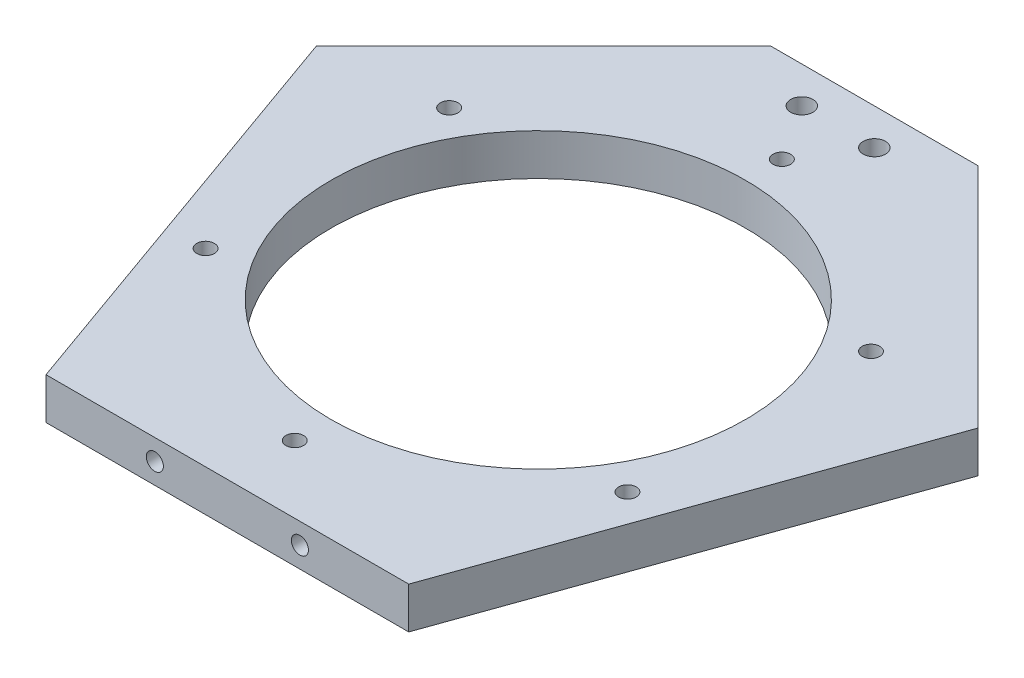
ISO-10303-21;
HEADER;
FILE_DESCRIPTION(('STEP AP214'),'2;1');
FILE_NAME('part.step','',(''),(''),'','','');
FILE_SCHEMA(('AUTOMOTIVE_DESIGN { 1 0 10303 214 1 1 1 1 }'));
ENDSEC;
DATA;
#1=APPLICATION_CONTEXT('core data for automotive mechanical design processes');
#2=APPLICATION_PROTOCOL_DEFINITION('international standard','automotive_design',2000,#1);
#3=PRODUCT_CONTEXT('',#1,'mechanical');
#4=PRODUCT('Part','Part','',(#3));
#5=PRODUCT_RELATED_PRODUCT_CATEGORY('part','',(#4));
#6=PRODUCT_DEFINITION_FORMATION('','',#4);
#7=PRODUCT_DEFINITION_CONTEXT('part definition',#1,'design');
#8=PRODUCT_DEFINITION('design','',#6,#7);
#9=PRODUCT_DEFINITION_SHAPE('','',#8);
#10=(LENGTH_UNIT() NAMED_UNIT(*) SI_UNIT(.MILLI.,.METRE.));
#11=(NAMED_UNIT(*) PLANE_ANGLE_UNIT() SI_UNIT($,.RADIAN.));
#12=(NAMED_UNIT(*) SI_UNIT($,.STERADIAN.) SOLID_ANGLE_UNIT());
#13=UNCERTAINTY_MEASURE_WITH_UNIT(LENGTH_MEASURE(1.E-05),#10,'distance_accuracy_value','');
#14=(GEOMETRIC_REPRESENTATION_CONTEXT(3) GLOBAL_UNCERTAINTY_ASSIGNED_CONTEXT((#13)) GLOBAL_UNIT_ASSIGNED_CONTEXT((#10,
#11,#12)) REPRESENTATION_CONTEXT('',''));
#15=CARTESIAN_POINT('',(0.,0.,0.));
#16=DIRECTION('',(0.,0.,1.));
#17=DIRECTION('',(1.,0.,0.));
#18=AXIS2_PLACEMENT_3D('',#15,#16,#17);
#19=CARTESIAN_POINT('',(0.,4.,0.));
#20=DIRECTION('',(0.,1.,0.));
#21=DIRECTION('',(0.,0.,1.));
#22=AXIS2_PLACEMENT_3D('',#19,#20,#21);
#23=PLANE('',#22);
#24=CARTESIAN_POINT('',(-7.,4.,-57.8528137423857));
#25=DIRECTION('',(0.,1.,0.));
#26=DIRECTION('',(0.,0.,1.));
#27=AXIS2_PLACEMENT_3D('',#24,#25,#26);
#28=CIRCLE('',#27,2.15);
#29=CARTESIAN_POINT('',(-7.,4.,-55.7028137423857));
#30=VERTEX_POINT('',#29);
#31=EDGE_CURVE('E269',#30,#30,#28,.T.);
#32=ORIENTED_EDGE('',*,*,#31,.F.);
#33=EDGE_LOOP('',(#32));
#34=FACE_BOUND('',#33,.T.);
#35=CARTESIAN_POINT('',(7.,4.,-57.8528137423857));
#36=DIRECTION('',(0.,1.,0.));
#37=DIRECTION('',(0.,0.,1.));
#38=AXIS2_PLACEMENT_3D('',#35,#36,#37);
#39=CIRCLE('',#38,2.15);
#40=CARTESIAN_POINT('',(7.,4.,-55.7028137423857));
#41=VERTEX_POINT('',#40);
#42=EDGE_CURVE('E271',#41,#41,#39,.T.);
#43=ORIENTED_EDGE('',*,*,#42,.F.);
#44=EDGE_LOOP('',(#43));
#45=FACE_BOUND('',#44,.T.);
#46=CARTESIAN_POINT('',(0.,4.,-47.));
#47=DIRECTION('',(0.,1.,0.));
#48=DIRECTION('',(0.,0.,1.));
#49=AXIS2_PLACEMENT_3D('',#46,#47,#48);
#50=CIRCLE('',#49,1.69999999999999);
#51=CARTESIAN_POINT('',(0.,4.,-45.3));
#52=VERTEX_POINT('',#51);
#53=EDGE_CURVE('E316',#52,#52,#50,.T.);
#54=ORIENTED_EDGE('',*,*,#53,.F.);
#55=EDGE_LOOP('',(#54));
#56=FACE_BOUND('',#55,.T.);
#57=CARTESIAN_POINT('',(40.7031939778709,4.,-23.5000000000041));
#58=DIRECTION('',(0.,1.,0.));
#59=DIRECTION('',(0.,0.,1.));
#60=AXIS2_PLACEMENT_3D('',#57,#58,#59);
#61=CIRCLE('',#60,1.69999999999999);
#62=CARTESIAN_POINT('',(40.7031939778709,4.,-21.8000000000041));
#63=VERTEX_POINT('',#62);
#64=EDGE_CURVE('E322',#63,#63,#61,.T.);
#65=ORIENTED_EDGE('',*,*,#64,.F.);
#66=EDGE_LOOP('',(#65));
#67=FACE_BOUND('',#66,.T.);
#68=CARTESIAN_POINT('',(40.7031939778756,4.,23.4999999999959));
#69=DIRECTION('',(0.,1.,0.));
#70=DIRECTION('',(0.,0.,1.));
#71=AXIS2_PLACEMENT_3D('',#68,#69,#70);
#72=CIRCLE('',#71,1.69999999999999);
#73=CARTESIAN_POINT('',(40.7031939778756,4.,25.1999999999959));
#74=VERTEX_POINT('',#73);
#75=EDGE_CURVE('E330',#74,#74,#72,.T.);
#76=ORIENTED_EDGE('',*,*,#75,.F.);
#77=EDGE_LOOP('',(#76));
#78=FACE_BOUND('',#77,.T.);
#79=CARTESIAN_POINT('',(9.33923072269093E-12,4.,47.));
#80=DIRECTION('',(0.,1.,0.));
#81=DIRECTION('',(0.,0.,1.));
#82=AXIS2_PLACEMENT_3D('',#79,#80,#81);
#83=CIRCLE('',#82,1.69999999999999);
#84=CARTESIAN_POINT('',(9.33923072269093E-12,4.,48.7));
#85=VERTEX_POINT('',#84);
#86=EDGE_CURVE('E336',#85,#85,#83,.T.);
#87=ORIENTED_EDGE('',*,*,#86,.F.);
#88=EDGE_LOOP('',(#87));
#89=FACE_BOUND('',#88,.T.);
#90=CARTESIAN_POINT('',(-40.7031939778616,4.,23.5000000000041));
#91=DIRECTION('',(0.,1.,0.));
#92=DIRECTION('',(0.,0.,1.));
#93=AXIS2_PLACEMENT_3D('',#90,#91,#92);
#94=CIRCLE('',#93,1.69999999999999);
#95=CARTESIAN_POINT('',(-40.7031939778616,4.,25.200000000004));
#96=VERTEX_POINT('',#95);
#97=EDGE_CURVE('E342',#96,#96,#94,.T.);
#98=ORIENTED_EDGE('',*,*,#97,.F.);
#99=EDGE_LOOP('',(#98));
#100=FACE_BOUND('',#99,.T.);
#101=CARTESIAN_POINT('',(-40.7031939778663,4.,-23.499999999996));
#102=DIRECTION('',(0.,1.,0.));
#103=DIRECTION('',(0.,0.,1.));
#104=AXIS2_PLACEMENT_3D('',#101,#102,#103);
#105=CIRCLE('',#104,1.69999999999999);
#106=CARTESIAN_POINT('',(-40.7031939778663,4.,-21.799999999996));
#107=VERTEX_POINT('',#106);
#108=EDGE_CURVE('E348',#107,#107,#105,.T.);
#109=ORIENTED_EDGE('',*,*,#108,.F.);
#110=EDGE_LOOP('',(#109));
#111=FACE_BOUND('',#110,.T.);
#112=DIRECTION('',(-0.707106781186547,0.,-0.707106781186548));
#113=VECTOR('',#112,1.);
#114=CARTESIAN_POINT('',(63.8406204335659,4.,-21.0121933088198));
#115=LINE('',#114,#113);
#116=CARTESIAN_POINT('',(63.8406204335659,4.,-21.0121933088198));
#117=VERTEX_POINT('',#116);
#118=CARTESIAN_POINT('',(20.,4.,-64.8528137423857));
#119=VERTEX_POINT('',#118);
#120=EDGE_CURVE('E146',#117,#119,#115,.T.);
#121=ORIENTED_EDGE('',*,*,#120,.T.);
#122=DIRECTION('',(-1.,0.,0.));
#123=VECTOR('',#122,1.);
#124=CARTESIAN_POINT('',(20.,4.,-64.8528137423857));
#125=LINE('',#124,#123);
#126=CARTESIAN_POINT('',(-20.,4.,-64.8528137423857));
#127=VERTEX_POINT('',#126);
#128=EDGE_CURVE('E100',#119,#127,#125,.T.);
#129=ORIENTED_EDGE('',*,*,#128,.T.);
#130=DIRECTION('',(-0.707106781186547,0.,0.707106781186548));
#131=VECTOR('',#130,1.);
#132=CARTESIAN_POINT('',(-20.,4.,-64.8528137423857));
#133=LINE('',#132,#131);
#134=CARTESIAN_POINT('',(-63.8406204335659,4.,-21.0121933088198));
#135=VERTEX_POINT('',#134);
#136=EDGE_CURVE('E115',#127,#135,#133,.T.);
#137=ORIENTED_EDGE('',*,*,#136,.T.);
#138=DIRECTION('',(0.335384239078004,0.,0.942081425450087));
#139=VECTOR('',#138,1.);
#140=CARTESIAN_POINT('',(-63.8406204335659,4.,-21.0121933088198));
#141=LINE('',#140,#139);
#142=CARTESIAN_POINT('',(-35.,4.,60.));
#143=VERTEX_POINT('',#142);
#144=EDGE_CURVE('E109',#135,#143,#141,.T.);
#145=ORIENTED_EDGE('',*,*,#144,.T.);
#146=DIRECTION('',(1.,0.,0.));
#147=VECTOR('',#146,1.);
#148=CARTESIAN_POINT('',(-35.,4.,60.));
#149=LINE('',#148,#147);
#150=CARTESIAN_POINT('',(35.,4.,60.));
#151=VERTEX_POINT('',#150);
#152=EDGE_CURVE('E113',#143,#151,#149,.T.);
#153=ORIENTED_EDGE('',*,*,#152,.T.);
#154=DIRECTION('',(0.335384239078004,0.,-0.942081425450087));
#155=VECTOR('',#154,1.);
#156=CARTESIAN_POINT('',(35.,4.,60.));
#157=LINE('',#156,#155);
#158=EDGE_CURVE('E62',#151,#117,#157,.T.);
#159=ORIENTED_EDGE('',*,*,#158,.T.);
#160=EDGE_LOOP('',(#121,#129,#137,#145,#153,#159));
#161=FACE_BOUND('',#160,.T.);
#162=CARTESIAN_POINT('',(0.,4.,0.));
#163=DIRECTION('',(0.,1.,0.));
#164=DIRECTION('',(0.,0.,1.));
#165=AXIS2_PLACEMENT_3D('',#162,#163,#164);
#166=CIRCLE('',#165,40.);
#167=CARTESIAN_POINT('',(0.,4.,40.));
#168=VERTEX_POINT('',#167);
#169=EDGE_CURVE('E138',#168,#168,#166,.T.);
#170=ORIENTED_EDGE('',*,*,#169,.F.);
#171=EDGE_LOOP('',(#170));
#172=FACE_BOUND('',#171,.T.);
#173=ADVANCED_FACE('F45',(#34,#45,#56,#67,#78,#89,#100,#111,#161,#172),#23,.T.);
#174=CARTESIAN_POINT('',(0.,-4.,0.));
#175=DIRECTION('',(0.,1.,0.));
#176=DIRECTION('',(0.,0.,1.));
#177=AXIS2_PLACEMENT_3D('',#174,#175,#176);
#178=PLANE('',#177);
#179=CARTESIAN_POINT('',(-7.,-4.,-57.8528137423857));
#180=DIRECTION('',(0.,1.,0.));
#181=DIRECTION('',(0.,0.,1.));
#182=AXIS2_PLACEMENT_3D('',#179,#180,#181);
#183=CIRCLE('',#182,2.15);
#184=CARTESIAN_POINT('',(-7.,-4.,-55.7028137423857));
#185=VERTEX_POINT('',#184);
#186=EDGE_CURVE('E267',#185,#185,#183,.T.);
#187=ORIENTED_EDGE('',*,*,#186,.T.);
#188=EDGE_LOOP('',(#187));
#189=FACE_BOUND('',#188,.T.);
#190=CARTESIAN_POINT('',(7.,-4.,-57.8528137423857));
#191=DIRECTION('',(0.,1.,0.));
#192=DIRECTION('',(0.,0.,1.));
#193=AXIS2_PLACEMENT_3D('',#190,#191,#192);
#194=CIRCLE('',#193,2.15);
#195=CARTESIAN_POINT('',(7.,-4.,-55.7028137423857));
#196=VERTEX_POINT('',#195);
#197=EDGE_CURVE('E276',#196,#196,#194,.T.);
#198=ORIENTED_EDGE('',*,*,#197,.T.);
#199=EDGE_LOOP('',(#198));
#200=FACE_BOUND('',#199,.T.);
#201=CARTESIAN_POINT('',(0.,-4.,-47.));
#202=DIRECTION('',(0.,1.,0.));
#203=DIRECTION('',(0.,0.,1.));
#204=AXIS2_PLACEMENT_3D('',#201,#202,#203);
#205=CIRCLE('',#204,1.7);
#206=CARTESIAN_POINT('',(0.,-4.,-45.3));
#207=VERTEX_POINT('',#206);
#208=EDGE_CURVE('E319',#207,#207,#205,.T.);
#209=ORIENTED_EDGE('',*,*,#208,.T.);
#210=EDGE_LOOP('',(#209));
#211=FACE_BOUND('',#210,.T.);
#212=CARTESIAN_POINT('',(40.7031939778709,-4.,-23.5000000000041));
#213=DIRECTION('',(0.,1.,0.));
#214=DIRECTION('',(0.,0.,1.));
#215=AXIS2_PLACEMENT_3D('',#212,#213,#214);
#216=CIRCLE('',#215,1.7);
#217=CARTESIAN_POINT('',(40.7031939778709,-4.,-21.800000000004));
#218=VERTEX_POINT('',#217);
#219=EDGE_CURVE('E326',#218,#218,#216,.T.);
#220=ORIENTED_EDGE('',*,*,#219,.T.);
#221=EDGE_LOOP('',(#220));
#222=FACE_BOUND('',#221,.T.);
#223=CARTESIAN_POINT('',(40.7031939778756,-4.,23.4999999999959));
#224=DIRECTION('',(0.,1.,0.));
#225=DIRECTION('',(0.,0.,1.));
#226=AXIS2_PLACEMENT_3D('',#223,#224,#225);
#227=CIRCLE('',#226,1.7);
#228=CARTESIAN_POINT('',(40.7031939778756,-4.,25.199999999996));
#229=VERTEX_POINT('',#228);
#230=EDGE_CURVE('E333',#229,#229,#227,.T.);
#231=ORIENTED_EDGE('',*,*,#230,.T.);
#232=EDGE_LOOP('',(#231));
#233=FACE_BOUND('',#232,.T.);
#234=CARTESIAN_POINT('',(9.33923072269093E-12,-4.,47.));
#235=DIRECTION('',(0.,1.,0.));
#236=DIRECTION('',(0.,0.,1.));
#237=AXIS2_PLACEMENT_3D('',#234,#235,#236);
#238=CIRCLE('',#237,1.7);
#239=CARTESIAN_POINT('',(9.33923072269093E-12,-4.,48.7));
#240=VERTEX_POINT('',#239);
#241=EDGE_CURVE('E339',#240,#240,#238,.T.);
#242=ORIENTED_EDGE('',*,*,#241,.T.);
#243=EDGE_LOOP('',(#242));
#244=FACE_BOUND('',#243,.T.);
#245=CARTESIAN_POINT('',(-40.7031939778616,-4.,23.5000000000041));
#246=DIRECTION('',(0.,1.,0.));
#247=DIRECTION('',(0.,0.,1.));
#248=AXIS2_PLACEMENT_3D('',#245,#246,#247);
#249=CIRCLE('',#248,1.7);
#250=CARTESIAN_POINT('',(-40.7031939778616,-4.,25.2000000000041));
#251=VERTEX_POINT('',#250);
#252=EDGE_CURVE('E345',#251,#251,#249,.T.);
#253=ORIENTED_EDGE('',*,*,#252,.T.);
#254=EDGE_LOOP('',(#253));
#255=FACE_BOUND('',#254,.T.);
#256=CARTESIAN_POINT('',(-40.7031939778663,-4.,-23.499999999996));
#257=DIRECTION('',(0.,1.,0.));
#258=DIRECTION('',(0.,0.,1.));
#259=AXIS2_PLACEMENT_3D('',#256,#257,#258);
#260=CIRCLE('',#259,1.7);
#261=CARTESIAN_POINT('',(-40.7031939778663,-4.,-21.799999999996));
#262=VERTEX_POINT('',#261);
#263=EDGE_CURVE('E351',#262,#262,#260,.T.);
#264=ORIENTED_EDGE('',*,*,#263,.T.);
#265=EDGE_LOOP('',(#264));
#266=FACE_BOUND('',#265,.T.);
#267=DIRECTION('',(-0.707106781186547,0.,-0.707106781186548));
#268=VECTOR('',#267,1.);
#269=CARTESIAN_POINT('',(63.8406204335659,-4.,-21.0121933088198));
#270=LINE('',#269,#268);
#271=CARTESIAN_POINT('',(63.8406204335659,-4.,-21.0121933088198));
#272=VERTEX_POINT('',#271);
#273=CARTESIAN_POINT('',(20.,-4.,-64.8528137423857));
#274=VERTEX_POINT('',#273);
#275=EDGE_CURVE('E134',#272,#274,#270,.T.);
#276=ORIENTED_EDGE('',*,*,#275,.F.);
#277=DIRECTION('',(0.335384239078004,0.,-0.942081425450087));
#278=VECTOR('',#277,1.);
#279=CARTESIAN_POINT('',(35.,-4.,60.));
#280=LINE('',#279,#278);
#281=CARTESIAN_POINT('',(35.,-4.,60.));
#282=VERTEX_POINT('',#281);
#283=EDGE_CURVE('E92',#282,#272,#280,.T.);
#284=ORIENTED_EDGE('',*,*,#283,.F.);
#285=DIRECTION('',(1.,0.,0.));
#286=VECTOR('',#285,1.);
#287=CARTESIAN_POINT('',(-35.,-4.,60.));
#288=LINE('',#287,#286);
#289=CARTESIAN_POINT('',(-35.,-4.,60.));
#290=VERTEX_POINT('',#289);
#291=EDGE_CURVE('E86',#290,#282,#288,.T.);
#292=ORIENTED_EDGE('',*,*,#291,.F.);
#293=DIRECTION('',(0.335384239078004,0.,0.942081425450087));
#294=VECTOR('',#293,1.);
#295=CARTESIAN_POINT('',(-63.8406204335659,-4.,-21.0121933088198));
#296=LINE('',#295,#294);
#297=CARTESIAN_POINT('',(-63.8406204335659,-4.,-21.0121933088198));
#298=VERTEX_POINT('',#297);
#299=EDGE_CURVE('E123',#298,#290,#296,.T.);
#300=ORIENTED_EDGE('',*,*,#299,.F.);
#301=DIRECTION('',(-0.707106781186547,0.,0.707106781186548));
#302=VECTOR('',#301,1.);
#303=CARTESIAN_POINT('',(-20.,-4.,-64.8528137423857));
#304=LINE('',#303,#302);
#305=CARTESIAN_POINT('',(-20.,-4.,-64.8528137423857));
#306=VERTEX_POINT('',#305);
#307=EDGE_CURVE('E140',#306,#298,#304,.T.);
#308=ORIENTED_EDGE('',*,*,#307,.F.);
#309=DIRECTION('',(-1.,0.,0.));
#310=VECTOR('',#309,1.);
#311=CARTESIAN_POINT('',(20.,-4.,-64.8528137423857));
#312=LINE('',#311,#310);
#313=EDGE_CURVE('E137',#274,#306,#312,.T.);
#314=ORIENTED_EDGE('',*,*,#313,.F.);
#315=EDGE_LOOP('',(#276,#284,#292,#300,#308,#314));
#316=FACE_BOUND('',#315,.T.);
#317=CARTESIAN_POINT('',(0.,-4.,0.));
#318=DIRECTION('',(0.,1.,0.));
#319=DIRECTION('',(0.,0.,1.));
#320=AXIS2_PLACEMENT_3D('',#317,#318,#319);
#321=CIRCLE('',#320,40.);
#322=CARTESIAN_POINT('',(0.,-4.,40.));
#323=VERTEX_POINT('',#322);
#324=EDGE_CURVE('E354',#323,#323,#321,.T.);
#325=ORIENTED_EDGE('',*,*,#324,.T.);
#326=EDGE_LOOP('',(#325));
#327=FACE_BOUND('',#326,.T.);
#328=ADVANCED_FACE('F155',(#189,#200,#211,#222,#233,#244,#255,#266,#316,#327),#178,.F.);
#329=CARTESIAN_POINT('',(63.8406204335659,4.,-21.0121933088198));
#330=DIRECTION('',(-0.707106781186548,0.,0.707106781186547));
#331=DIRECTION('',(0.707106781186547,0.,0.707106781186548));
#332=AXIS2_PLACEMENT_3D('',#329,#330,#331);
#333=PLANE('',#332);
#334=CARTESIAN_POINT('',(32.5269119345812,0.,-52.3259018078045));
#335=DIRECTION('',(0.707106781186548,0.,-0.707106781186548));
#336=DIRECTION('',(-0.707106781186548,0.,-0.707106781186548));
#337=AXIS2_PLACEMENT_3D('',#334,#335,#336);
#338=CIRCLE('',#337,1.64999999999999);
#339=CARTESIAN_POINT('',(31.3601857456234,0.,-53.4926279967623));
#340=VERTEX_POINT('',#339);
#341=EDGE_CURVE('E303',#340,#340,#338,.T.);
#342=ORIENTED_EDGE('',*,*,#341,.F.);
#343=EDGE_LOOP('',(#342));
#344=FACE_BOUND('',#343,.T.);
#345=CARTESIAN_POINT('',(52.3259018078045,0.,-32.5269119345812));
#346=DIRECTION('',(0.707106781186548,0.,-0.707106781186548));
#347=DIRECTION('',(-0.707106781186548,0.,-0.707106781186548));
#348=AXIS2_PLACEMENT_3D('',#345,#346,#347);
#349=CIRCLE('',#348,1.64999999999999);
#350=CARTESIAN_POINT('',(51.1591756188467,0.,-33.693638123539));
#351=VERTEX_POINT('',#350);
#352=EDGE_CURVE('E309',#351,#351,#349,.T.);
#353=ORIENTED_EDGE('',*,*,#352,.F.);
#354=EDGE_LOOP('',(#353));
#355=FACE_BOUND('',#354,.T.);
#356=ORIENTED_EDGE('',*,*,#275,.T.);
#357=DIRECTION('',(0.,-1.,0.));
#358=VECTOR('',#357,1.);
#359=CARTESIAN_POINT('',(20.,4.,-64.8528137423857));
#360=LINE('',#359,#358);
#361=EDGE_CURVE('E11',#119,#274,#360,.T.);
#362=ORIENTED_EDGE('',*,*,#361,.F.);
#363=ORIENTED_EDGE('',*,*,#120,.F.);
#364=DIRECTION('',(0.,-1.,0.));
#365=VECTOR('',#364,1.);
#366=CARTESIAN_POINT('',(63.8406204335659,4.,-21.0121933088198));
#367=LINE('',#366,#365);
#368=EDGE_CURVE('E130',#117,#272,#367,.T.);
#369=ORIENTED_EDGE('',*,*,#368,.T.);
#370=EDGE_LOOP('',(#356,#362,#363,#369));
#371=FACE_BOUND('',#370,.T.);
#372=ADVANCED_FACE('F47',(#344,#355,#371),#333,.F.);
#373=CARTESIAN_POINT('',(20.,4.,-64.8528137423857));
#374=DIRECTION('',(0.,0.,1.));
#375=DIRECTION('',(1.,0.,0.));
#376=AXIS2_PLACEMENT_3D('',#373,#374,#375);
#377=PLANE('',#376);
#378=ORIENTED_EDGE('',*,*,#313,.T.);
#379=DIRECTION('',(0.,-1.,0.));
#380=VECTOR('',#379,1.);
#381=CARTESIAN_POINT('',(-20.,4.,-64.8528137423857));
#382=LINE('',#381,#380);
#383=EDGE_CURVE('E54',#127,#306,#382,.T.);
#384=ORIENTED_EDGE('',*,*,#383,.F.);
#385=ORIENTED_EDGE('',*,*,#128,.F.);
#386=ORIENTED_EDGE('',*,*,#361,.T.);
#387=EDGE_LOOP('',(#378,#384,#385,#386));
#388=FACE_BOUND('',#387,.T.);
#389=ADVANCED_FACE('F401',(#388),#377,.F.);
#390=CARTESIAN_POINT('',(-20.,4.,-64.8528137423857));
#391=DIRECTION('',(0.707106781186548,0.,0.707106781186547));
#392=DIRECTION('',(0.707106781186547,0.,-0.707106781186548));
#393=AXIS2_PLACEMENT_3D('',#390,#391,#392);
#394=PLANE('',#393);
#395=CARTESIAN_POINT('',(-32.5269119345812,0.,-52.3259018078045));
#396=DIRECTION('',(-0.707106781186548,0.,-0.707106781186548));
#397=DIRECTION('',(-0.707106781186548,0.,0.707106781186548));
#398=AXIS2_PLACEMENT_3D('',#395,#396,#397);
#399=CIRCLE('',#398,1.64999999999999);
#400=CARTESIAN_POINT('',(-33.693638123539,0.,-51.1591756188467));
#401=VERTEX_POINT('',#400);
#402=EDGE_CURVE('E291',#401,#401,#399,.T.);
#403=ORIENTED_EDGE('',*,*,#402,.F.);
#404=EDGE_LOOP('',(#403));
#405=FACE_BOUND('',#404,.T.);
#406=CARTESIAN_POINT('',(-52.3259018078045,0.,-32.5269119345812));
#407=DIRECTION('',(-0.707106781186548,0.,-0.707106781186548));
#408=DIRECTION('',(-0.707106781186548,0.,0.707106781186548));
#409=AXIS2_PLACEMENT_3D('',#406,#407,#408);
#410=CIRCLE('',#409,1.64999999999999);
#411=CARTESIAN_POINT('',(-53.4926279967623,0.,-31.3601857456234));
#412=VERTEX_POINT('',#411);
#413=EDGE_CURVE('E297',#412,#412,#410,.T.);
#414=ORIENTED_EDGE('',*,*,#413,.F.);
#415=EDGE_LOOP('',(#414));
#416=FACE_BOUND('',#415,.T.);
#417=ORIENTED_EDGE('',*,*,#307,.T.);
#418=DIRECTION('',(0.,-1.,0.));
#419=VECTOR('',#418,1.);
#420=CARTESIAN_POINT('',(-63.8406204335659,4.,-21.0121933088198));
#421=LINE('',#420,#419);
#422=EDGE_CURVE('E124',#135,#298,#421,.T.);
#423=ORIENTED_EDGE('',*,*,#422,.F.);
#424=ORIENTED_EDGE('',*,*,#136,.F.);
#425=ORIENTED_EDGE('',*,*,#383,.T.);
#426=EDGE_LOOP('',(#417,#423,#424,#425));
#427=FACE_BOUND('',#426,.T.);
#428=ADVANCED_FACE('F152',(#405,#416,#427),#394,.F.);
#429=CARTESIAN_POINT('',(-63.8406204335659,4.,-21.0121933088198));
#430=DIRECTION('',(0.942081425450087,0.,-0.335384239078004));
#431=DIRECTION('',(-0.335384239078004,0.,-0.942081425450087));
#432=AXIS2_PLACEMENT_3D('',#429,#430,#431);
#433=PLANE('',#432);
#434=ORIENTED_EDGE('',*,*,#299,.T.);
#435=DIRECTION('',(0.,-1.,0.));
#436=VECTOR('',#435,1.);
#437=CARTESIAN_POINT('',(-35.,4.,60.));
#438=LINE('',#437,#436);
#439=EDGE_CURVE('E120',#143,#290,#438,.T.);
#440=ORIENTED_EDGE('',*,*,#439,.F.);
#441=ORIENTED_EDGE('',*,*,#144,.F.);
#442=ORIENTED_EDGE('',*,*,#422,.T.);
#443=EDGE_LOOP('',(#434,#440,#441,#442));
#444=FACE_BOUND('',#443,.T.);
#445=ADVANCED_FACE('F121',(#444),#433,.F.);
#446=CARTESIAN_POINT('',(-35.,4.,60.));
#447=DIRECTION('',(0.,0.,-1.));
#448=DIRECTION('',(-1.,0.,0.));
#449=AXIS2_PLACEMENT_3D('',#446,#447,#448);
#450=PLANE('',#449);
#451=CARTESIAN_POINT('',(14.,0.,60.));
#452=DIRECTION('',(0.,0.,1.));
#453=DIRECTION('',(1.,0.,0.));
#454=AXIS2_PLACEMENT_3D('',#451,#452,#453);
#455=CIRCLE('',#454,1.64999999999999);
#456=CARTESIAN_POINT('',(15.65,0.,60.));
#457=VERTEX_POINT('',#456);
#458=EDGE_CURVE('E279',#457,#457,#455,.T.);
#459=ORIENTED_EDGE('',*,*,#458,.F.);
#460=EDGE_LOOP('',(#459));
#461=FACE_BOUND('',#460,.T.);
#462=CARTESIAN_POINT('',(-14.,0.,60.));
#463=DIRECTION('',(0.,0.,1.));
#464=DIRECTION('',(1.,0.,0.));
#465=AXIS2_PLACEMENT_3D('',#462,#463,#464);
#466=CIRCLE('',#465,1.64999999999999);
#467=CARTESIAN_POINT('',(-12.35,0.,60.));
#468=VERTEX_POINT('',#467);
#469=EDGE_CURVE('E285',#468,#468,#466,.T.);
#470=ORIENTED_EDGE('',*,*,#469,.F.);
#471=EDGE_LOOP('',(#470));
#472=FACE_BOUND('',#471,.T.);
#473=ORIENTED_EDGE('',*,*,#291,.T.);
#474=DIRECTION('',(0.,-1.,0.));
#475=VECTOR('',#474,1.);
#476=CARTESIAN_POINT('',(35.,4.,60.));
#477=LINE('',#476,#475);
#478=EDGE_CURVE('E125',#151,#282,#477,.T.);
#479=ORIENTED_EDGE('',*,*,#478,.F.);
#480=ORIENTED_EDGE('',*,*,#152,.F.);
#481=ORIENTED_EDGE('',*,*,#439,.T.);
#482=EDGE_LOOP('',(#473,#479,#480,#481));
#483=FACE_BOUND('',#482,.T.);
#484=ADVANCED_FACE('F127',(#461,#472,#483),#450,.F.);
#485=CARTESIAN_POINT('',(35.,4.,60.));
#486=DIRECTION('',(-0.942081425450087,0.,-0.335384239078004));
#487=DIRECTION('',(-0.335384239078004,0.,0.942081425450087));
#488=AXIS2_PLACEMENT_3D('',#485,#486,#487);
#489=PLANE('',#488);
#490=ORIENTED_EDGE('',*,*,#283,.T.);
#491=ORIENTED_EDGE('',*,*,#368,.F.);
#492=ORIENTED_EDGE('',*,*,#158,.F.);
#493=ORIENTED_EDGE('',*,*,#478,.T.);
#494=EDGE_LOOP('',(#490,#491,#492,#493));
#495=FACE_BOUND('',#494,.T.);
#496=ADVANCED_FACE('F160',(#495),#489,.F.);
#497=CARTESIAN_POINT('',(0.,4.,0.));
#498=DIRECTION('',(0.,-1.,0.));
#499=DIRECTION('',(0.,0.,-1.));
#500=AXIS2_PLACEMENT_3D('',#497,#498,#499);
#501=CYLINDRICAL_SURFACE('',#500,40.);
#502=ORIENTED_EDGE('',*,*,#169,.T.);
#503=EDGE_LOOP('',(#502));
#504=FACE_BOUND('',#503,.T.);
#505=ORIENTED_EDGE('',*,*,#324,.F.);
#506=EDGE_LOOP('',(#505));
#507=FACE_BOUND('',#506,.T.);
#508=ADVANCED_FACE('F162',(#504,#507),#501,.F.);
#509=CARTESIAN_POINT('',(-40.7031939778663,4.,-23.499999999996));
#510=DIRECTION('',(0.,1.,0.));
#511=DIRECTION('',(0.,0.,1.));
#512=AXIS2_PLACEMENT_3D('',#509,#510,#511);
#513=CYLINDRICAL_SURFACE('',#512,1.69999999999999);
#514=ORIENTED_EDGE('',*,*,#263,.F.);
#515=EDGE_LOOP('',(#514));
#516=FACE_BOUND('',#515,.T.);
#517=ORIENTED_EDGE('',*,*,#108,.T.);
#518=EDGE_LOOP('',(#517));
#519=FACE_BOUND('',#518,.T.);
#520=ADVANCED_FACE('F168',(#516,#519),#513,.F.);
#521=CARTESIAN_POINT('',(-40.7031939778616,4.,23.5000000000041));
#522=DIRECTION('',(0.,1.,0.));
#523=DIRECTION('',(0.,0.,1.));
#524=AXIS2_PLACEMENT_3D('',#521,#522,#523);
#525=CYLINDRICAL_SURFACE('',#524,1.69999999999999);
#526=ORIENTED_EDGE('',*,*,#252,.F.);
#527=EDGE_LOOP('',(#526));
#528=FACE_BOUND('',#527,.T.);
#529=ORIENTED_EDGE('',*,*,#97,.T.);
#530=EDGE_LOOP('',(#529));
#531=FACE_BOUND('',#530,.T.);
#532=ADVANCED_FACE('F186',(#528,#531),#525,.F.);
#533=CARTESIAN_POINT('',(9.33923072269093E-12,4.,47.));
#534=DIRECTION('',(0.,1.,0.));
#535=DIRECTION('',(0.,0.,1.));
#536=AXIS2_PLACEMENT_3D('',#533,#534,#535);
#537=CYLINDRICAL_SURFACE('',#536,1.69999999999999);
#538=ORIENTED_EDGE('',*,*,#241,.F.);
#539=EDGE_LOOP('',(#538));
#540=FACE_BOUND('',#539,.T.);
#541=ORIENTED_EDGE('',*,*,#86,.T.);
#542=EDGE_LOOP('',(#541));
#543=FACE_BOUND('',#542,.T.);
#544=ADVANCED_FACE('F190',(#540,#543),#537,.F.);
#545=CARTESIAN_POINT('',(40.7031939778756,4.,23.4999999999959));
#546=DIRECTION('',(0.,1.,0.));
#547=DIRECTION('',(0.,0.,1.));
#548=AXIS2_PLACEMENT_3D('',#545,#546,#547);
#549=CYLINDRICAL_SURFACE('',#548,1.69999999999999);
#550=ORIENTED_EDGE('',*,*,#230,.F.);
#551=EDGE_LOOP('',(#550));
#552=FACE_BOUND('',#551,.T.);
#553=ORIENTED_EDGE('',*,*,#75,.T.);
#554=EDGE_LOOP('',(#553));
#555=FACE_BOUND('',#554,.T.);
#556=ADVANCED_FACE('F194',(#552,#555),#549,.F.);
#557=CARTESIAN_POINT('',(40.7031939778709,4.,-23.5000000000041));
#558=DIRECTION('',(0.,1.,0.));
#559=DIRECTION('',(0.,0.,1.));
#560=AXIS2_PLACEMENT_3D('',#557,#558,#559);
#561=CYLINDRICAL_SURFACE('',#560,1.69999999999999);
#562=ORIENTED_EDGE('',*,*,#219,.F.);
#563=EDGE_LOOP('',(#562));
#564=FACE_BOUND('',#563,.T.);
#565=ORIENTED_EDGE('',*,*,#64,.T.);
#566=EDGE_LOOP('',(#565));
#567=FACE_BOUND('',#566,.T.);
#568=ADVANCED_FACE('F198',(#564,#567),#561,.F.);
#569=CARTESIAN_POINT('',(0.,4.,-47.));
#570=DIRECTION('',(0.,1.,0.));
#571=DIRECTION('',(0.,0.,1.));
#572=AXIS2_PLACEMENT_3D('',#569,#570,#571);
#573=CYLINDRICAL_SURFACE('',#572,1.69999999999999);
#574=ORIENTED_EDGE('',*,*,#208,.F.);
#575=EDGE_LOOP('',(#574));
#576=FACE_BOUND('',#575,.T.);
#577=ORIENTED_EDGE('',*,*,#53,.T.);
#578=EDGE_LOOP('',(#577));
#579=FACE_BOUND('',#578,.T.);
#580=ADVANCED_FACE('F202',(#576,#579),#573,.F.);
#581=CARTESIAN_POINT('',(43.8406204335659,0.,-24.0416305603426));
#582=DIRECTION('',(0.707106781186548,0.,-0.707106781186548));
#583=DIRECTION('',(-0.707106781186548,0.,-0.707106781186548));
#584=AXIS2_PLACEMENT_3D('',#581,#582,#583);
#585=CONICAL_SURFACE('',#584,1.65,1.02974425867665);
#586=CARTESIAN_POINT('',(43.1395806134331,0.,-23.3405907402098));
#587=VERTEX_POINT('',#586);
#588=VERTEX_LOOP('',#587);
#589=FACE_BOUND('',#588,.T.);
#590=CARTESIAN_POINT('',(43.8406204335659,0.,-24.0416305603426));
#591=DIRECTION('',(0.707106781186548,0.,-0.707106781186548));
#592=DIRECTION('',(-0.707106781186548,0.,-0.707106781186548));
#593=AXIS2_PLACEMENT_3D('',#590,#591,#592);
#594=CIRCLE('',#593,1.65);
#595=CARTESIAN_POINT('',(42.6738942446081,0.,-25.2083567493004));
#596=VERTEX_POINT('',#595);
#597=EDGE_CURVE('E312',#596,#596,#594,.T.);
#598=ORIENTED_EDGE('',*,*,#597,.T.);
#599=EDGE_LOOP('',(#598));
#600=FACE_BOUND('',#599,.T.);
#601=ADVANCED_FACE('F206',(#589,#600),#585,.F.);
#602=CARTESIAN_POINT('',(52.3259018078045,0.,-32.5269119345812));
#603=DIRECTION('',(0.707106781186548,0.,-0.707106781186548));
#604=DIRECTION('',(-0.707106781186548,0.,-0.707106781186548));
#605=AXIS2_PLACEMENT_3D('',#602,#603,#604);
#606=CYLINDRICAL_SURFACE('',#605,1.64999999999999);
#607=ORIENTED_EDGE('',*,*,#597,.F.);
#608=EDGE_LOOP('',(#607));
#609=FACE_BOUND('',#608,.T.);
#610=ORIENTED_EDGE('',*,*,#352,.T.);
#611=EDGE_LOOP('',(#610));
#612=FACE_BOUND('',#611,.T.);
#613=ADVANCED_FACE('F210',(#609,#612),#606,.F.);
#614=CARTESIAN_POINT('',(24.0416305603426,0.,-43.8406204335659));
#615=DIRECTION('',(0.707106781186548,0.,-0.707106781186548));
#616=DIRECTION('',(-0.707106781186548,0.,-0.707106781186548));
#617=AXIS2_PLACEMENT_3D('',#614,#615,#616);
#618=CONICAL_SURFACE('',#617,1.65,1.02974425867665);
#619=CARTESIAN_POINT('',(23.3405907402098,0.,-43.1395806134331));
#620=VERTEX_POINT('',#619);
#621=VERTEX_LOOP('',#620);
#622=FACE_BOUND('',#621,.T.);
#623=CARTESIAN_POINT('',(24.0416305603426,0.,-43.8406204335659));
#624=DIRECTION('',(0.707106781186548,0.,-0.707106781186548));
#625=DIRECTION('',(-0.707106781186548,0.,-0.707106781186548));
#626=AXIS2_PLACEMENT_3D('',#623,#624,#625);
#627=CIRCLE('',#626,1.65);
#628=CARTESIAN_POINT('',(22.8749043713848,0.,-45.0073466225237));
#629=VERTEX_POINT('',#628);
#630=EDGE_CURVE('E306',#629,#629,#627,.T.);
#631=ORIENTED_EDGE('',*,*,#630,.T.);
#632=EDGE_LOOP('',(#631));
#633=FACE_BOUND('',#632,.T.);
#634=ADVANCED_FACE('F214',(#622,#633),#618,.F.);
#635=CARTESIAN_POINT('',(32.5269119345812,0.,-52.3259018078045));
#636=DIRECTION('',(0.707106781186548,0.,-0.707106781186548));
#637=DIRECTION('',(-0.707106781186548,0.,-0.707106781186548));
#638=AXIS2_PLACEMENT_3D('',#635,#636,#637);
#639=CYLINDRICAL_SURFACE('',#638,1.64999999999999);
#640=ORIENTED_EDGE('',*,*,#630,.F.);
#641=EDGE_LOOP('',(#640));
#642=FACE_BOUND('',#641,.T.);
#643=ORIENTED_EDGE('',*,*,#341,.T.);
#644=EDGE_LOOP('',(#643));
#645=FACE_BOUND('',#644,.T.);
#646=ADVANCED_FACE('F218',(#642,#645),#639,.F.);
#647=CARTESIAN_POINT('',(-43.8406204335659,0.,-24.0416305603426));
#648=DIRECTION('',(-0.707106781186548,0.,-0.707106781186548));
#649=DIRECTION('',(-0.707106781186548,0.,0.707106781186548));
#650=AXIS2_PLACEMENT_3D('',#647,#648,#649);
#651=CONICAL_SURFACE('',#650,1.65,1.02974425867665);
#652=CARTESIAN_POINT('',(-43.1395806134331,0.,-23.3405907402098));
#653=VERTEX_POINT('',#652);
#654=VERTEX_LOOP('',#653);
#655=FACE_BOUND('',#654,.T.);
#656=CARTESIAN_POINT('',(-43.8406204335659,0.,-24.0416305603426));
#657=DIRECTION('',(-0.707106781186548,0.,-0.707106781186548));
#658=DIRECTION('',(-0.707106781186548,0.,0.707106781186548));
#659=AXIS2_PLACEMENT_3D('',#656,#657,#658);
#660=CIRCLE('',#659,1.65);
#661=CARTESIAN_POINT('',(-45.0073466225237,0.,-22.8749043713848));
#662=VERTEX_POINT('',#661);
#663=EDGE_CURVE('E300',#662,#662,#660,.T.);
#664=ORIENTED_EDGE('',*,*,#663,.T.);
#665=EDGE_LOOP('',(#664));
#666=FACE_BOUND('',#665,.T.);
#667=ADVANCED_FACE('F222',(#655,#666),#651,.F.);
#668=CARTESIAN_POINT('',(-52.3259018078045,0.,-32.5269119345812));
#669=DIRECTION('',(-0.707106781186548,0.,-0.707106781186548));
#670=DIRECTION('',(-0.707106781186548,0.,0.707106781186548));
#671=AXIS2_PLACEMENT_3D('',#668,#669,#670);
#672=CYLINDRICAL_SURFACE('',#671,1.64999999999999);
#673=ORIENTED_EDGE('',*,*,#663,.F.);
#674=EDGE_LOOP('',(#673));
#675=FACE_BOUND('',#674,.T.);
#676=ORIENTED_EDGE('',*,*,#413,.T.);
#677=EDGE_LOOP('',(#676));
#678=FACE_BOUND('',#677,.T.);
#679=ADVANCED_FACE('F226',(#675,#678),#672,.F.);
#680=CARTESIAN_POINT('',(-24.0416305603426,0.,-43.8406204335659));
#681=DIRECTION('',(-0.707106781186548,0.,-0.707106781186548));
#682=DIRECTION('',(-0.707106781186548,0.,0.707106781186548));
#683=AXIS2_PLACEMENT_3D('',#680,#681,#682);
#684=CONICAL_SURFACE('',#683,1.65,1.02974425867665);
#685=CARTESIAN_POINT('',(-23.3405907402098,0.,-43.1395806134331));
#686=VERTEX_POINT('',#685);
#687=VERTEX_LOOP('',#686);
#688=FACE_BOUND('',#687,.T.);
#689=CARTESIAN_POINT('',(-24.0416305603426,0.,-43.8406204335659));
#690=DIRECTION('',(-0.707106781186548,0.,-0.707106781186548));
#691=DIRECTION('',(-0.707106781186548,0.,0.707106781186548));
#692=AXIS2_PLACEMENT_3D('',#689,#690,#691);
#693=CIRCLE('',#692,1.65);
#694=CARTESIAN_POINT('',(-25.2083567493004,0.,-42.6738942446081));
#695=VERTEX_POINT('',#694);
#696=EDGE_CURVE('E294',#695,#695,#693,.T.);
#697=ORIENTED_EDGE('',*,*,#696,.T.);
#698=EDGE_LOOP('',(#697));
#699=FACE_BOUND('',#698,.T.);
#700=ADVANCED_FACE('F230',(#688,#699),#684,.F.);
#701=CARTESIAN_POINT('',(-32.5269119345812,0.,-52.3259018078045));
#702=DIRECTION('',(-0.707106781186548,0.,-0.707106781186548));
#703=DIRECTION('',(-0.707106781186548,0.,0.707106781186548));
#704=AXIS2_PLACEMENT_3D('',#701,#702,#703);
#705=CYLINDRICAL_SURFACE('',#704,1.64999999999999);
#706=ORIENTED_EDGE('',*,*,#696,.F.);
#707=EDGE_LOOP('',(#706));
#708=FACE_BOUND('',#707,.T.);
#709=ORIENTED_EDGE('',*,*,#402,.T.);
#710=EDGE_LOOP('',(#709));
#711=FACE_BOUND('',#710,.T.);
#712=ADVANCED_FACE('F234',(#708,#711),#705,.F.);
#713=CARTESIAN_POINT('',(-14.,0.,45.));
#714=DIRECTION('',(0.,0.,1.));
#715=DIRECTION('',(1.,0.,0.));
#716=AXIS2_PLACEMENT_3D('',#713,#714,#715);
#717=CONICAL_SURFACE('',#716,1.65,1.02974425867665);
#718=CARTESIAN_POINT('',(-14.,0.,44.0085799786045));
#719=VERTEX_POINT('',#718);
#720=VERTEX_LOOP('',#719);
#721=FACE_BOUND('',#720,.T.);
#722=CARTESIAN_POINT('',(-14.,0.,45.));
#723=DIRECTION('',(0.,0.,1.));
#724=DIRECTION('',(1.,0.,0.));
#725=AXIS2_PLACEMENT_3D('',#722,#723,#724);
#726=CIRCLE('',#725,1.65);
#727=CARTESIAN_POINT('',(-12.35,0.,45.));
#728=VERTEX_POINT('',#727);
#729=EDGE_CURVE('E288',#728,#728,#726,.T.);
#730=ORIENTED_EDGE('',*,*,#729,.T.);
#731=EDGE_LOOP('',(#730));
#732=FACE_BOUND('',#731,.T.);
#733=ADVANCED_FACE('F238',(#721,#732),#717,.F.);
#734=CARTESIAN_POINT('',(-14.,0.,60.));
#735=DIRECTION('',(0.,0.,1.));
#736=DIRECTION('',(1.,0.,0.));
#737=AXIS2_PLACEMENT_3D('',#734,#735,#736);
#738=CYLINDRICAL_SURFACE('',#737,1.64999999999999);
#739=ORIENTED_EDGE('',*,*,#729,.F.);
#740=EDGE_LOOP('',(#739));
#741=FACE_BOUND('',#740,.T.);
#742=ORIENTED_EDGE('',*,*,#469,.T.);
#743=EDGE_LOOP('',(#742));
#744=FACE_BOUND('',#743,.T.);
#745=ADVANCED_FACE('F242',(#741,#744),#738,.F.);
#746=CARTESIAN_POINT('',(14.,0.,45.));
#747=DIRECTION('',(0.,0.,1.));
#748=DIRECTION('',(1.,0.,0.));
#749=AXIS2_PLACEMENT_3D('',#746,#747,#748);
#750=CONICAL_SURFACE('',#749,1.65,1.02974425867665);
#751=CARTESIAN_POINT('',(14.,0.,44.0085799786045));
#752=VERTEX_POINT('',#751);
#753=VERTEX_LOOP('',#752);
#754=FACE_BOUND('',#753,.T.);
#755=CARTESIAN_POINT('',(14.,0.,45.));
#756=DIRECTION('',(0.,0.,1.));
#757=DIRECTION('',(1.,0.,0.));
#758=AXIS2_PLACEMENT_3D('',#755,#756,#757);
#759=CIRCLE('',#758,1.65);
#760=CARTESIAN_POINT('',(15.65,0.,45.));
#761=VERTEX_POINT('',#760);
#762=EDGE_CURVE('E282',#761,#761,#759,.T.);
#763=ORIENTED_EDGE('',*,*,#762,.T.);
#764=EDGE_LOOP('',(#763));
#765=FACE_BOUND('',#764,.T.);
#766=ADVANCED_FACE('F246',(#754,#765),#750,.F.);
#767=CARTESIAN_POINT('',(14.,0.,60.));
#768=DIRECTION('',(0.,0.,1.));
#769=DIRECTION('',(1.,0.,0.));
#770=AXIS2_PLACEMENT_3D('',#767,#768,#769);
#771=CYLINDRICAL_SURFACE('',#770,1.64999999999999);
#772=ORIENTED_EDGE('',*,*,#762,.F.);
#773=EDGE_LOOP('',(#772));
#774=FACE_BOUND('',#773,.T.);
#775=ORIENTED_EDGE('',*,*,#458,.T.);
#776=EDGE_LOOP('',(#775));
#777=FACE_BOUND('',#776,.T.);
#778=ADVANCED_FACE('F250',(#774,#777),#771,.F.);
#779=CARTESIAN_POINT('',(7.,4.,-57.8528137423857));
#780=DIRECTION('',(0.,1.,0.));
#781=DIRECTION('',(0.,0.,1.));
#782=AXIS2_PLACEMENT_3D('',#779,#780,#781);
#783=CYLINDRICAL_SURFACE('',#782,2.15);
#784=ORIENTED_EDGE('',*,*,#197,.F.);
#785=EDGE_LOOP('',(#784));
#786=FACE_BOUND('',#785,.T.);
#787=ORIENTED_EDGE('',*,*,#42,.T.);
#788=EDGE_LOOP('',(#787));
#789=FACE_BOUND('',#788,.T.);
#790=ADVANCED_FACE('F254',(#786,#789),#783,.F.);
#791=CARTESIAN_POINT('',(-7.,4.,-57.8528137423857));
#792=DIRECTION('',(0.,1.,0.));
#793=DIRECTION('',(0.,0.,1.));
#794=AXIS2_PLACEMENT_3D('',#791,#792,#793);
#795=CYLINDRICAL_SURFACE('',#794,2.15);
#796=ORIENTED_EDGE('',*,*,#186,.F.);
#797=EDGE_LOOP('',(#796));
#798=FACE_BOUND('',#797,.T.);
#799=ORIENTED_EDGE('',*,*,#31,.T.);
#800=EDGE_LOOP('',(#799));
#801=FACE_BOUND('',#800,.T.);
#802=ADVANCED_FACE('F258',(#798,#801),#795,.F.);
#803=CLOSED_SHELL('',(#173,#328,#372,#389,#428,#445,#484,#496,#508,#520,#532,#544,#556,#568,
#580,#601,#613,#634,#646,#667,#679,#700,#712,#733,#745,#766,#778,#790,#802));
#804=MANIFOLD_SOLID_BREP('B2',#803);
#805=ADVANCED_BREP_SHAPE_REPRESENTATION('',(#18,#804),#14);
#806=SHAPE_DEFINITION_REPRESENTATION(#9,#805);
ENDSEC;
END-ISO-10303-21;
